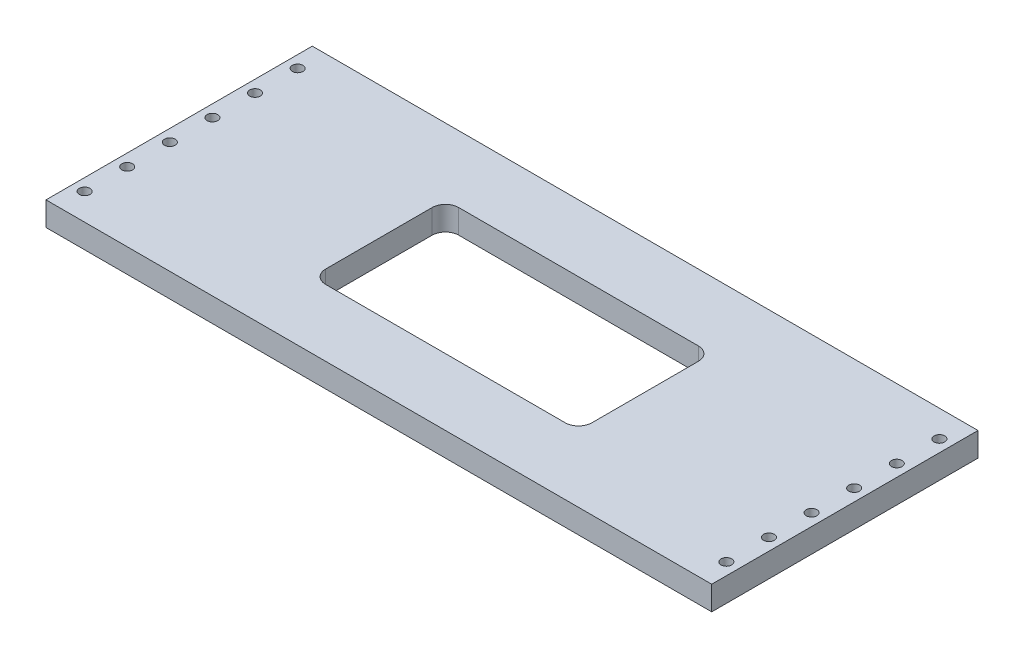
ISO-10303-21;
HEADER;
FILE_DESCRIPTION(('STEP AP214'),'2;1');
FILE_NAME('part.step','',(''),(''),'','','');
FILE_SCHEMA(('AUTOMOTIVE_DESIGN { 1 0 10303 214 1 1 1 1 }'));
ENDSEC;
DATA;
#1=APPLICATION_CONTEXT('core data for automotive mechanical design processes');
#2=APPLICATION_PROTOCOL_DEFINITION('international standard','automotive_design',2000,#1);
#3=PRODUCT_CONTEXT('',#1,'mechanical');
#4=PRODUCT('Part','Part','',(#3));
#5=PRODUCT_RELATED_PRODUCT_CATEGORY('part','',(#4));
#6=PRODUCT_DEFINITION_FORMATION('','',#4);
#7=PRODUCT_DEFINITION_CONTEXT('part definition',#1,'design');
#8=PRODUCT_DEFINITION('design','',#6,#7);
#9=PRODUCT_DEFINITION_SHAPE('','',#8);
#10=(LENGTH_UNIT() NAMED_UNIT(*) SI_UNIT(.MILLI.,.METRE.));
#11=(NAMED_UNIT(*) PLANE_ANGLE_UNIT() SI_UNIT($,.RADIAN.));
#12=(NAMED_UNIT(*) SI_UNIT($,.STERADIAN.) SOLID_ANGLE_UNIT());
#13=UNCERTAINTY_MEASURE_WITH_UNIT(LENGTH_MEASURE(1.E-05),#10,'distance_accuracy_value','');
#14=(GEOMETRIC_REPRESENTATION_CONTEXT(3) GLOBAL_UNCERTAINTY_ASSIGNED_CONTEXT((#13)) GLOBAL_UNIT_ASSIGNED_CONTEXT((#10,
#11,#12)) REPRESENTATION_CONTEXT('',''));
#15=CARTESIAN_POINT('',(0.,0.,0.));
#16=DIRECTION('',(0.,0.,1.));
#17=DIRECTION('',(1.,0.,0.));
#18=AXIS2_PLACEMENT_3D('',#15,#16,#17);
#19=CARTESIAN_POINT('',(0.,18.,0.));
#20=DIRECTION('',(1.,0.,0.));
#21=DIRECTION('',(0.,0.,-1.));
#22=AXIS2_PLACEMENT_3D('',#19,#20,#21);
#23=PLANE('',#22);
#24=DIRECTION('',(0.,0.,1.));
#25=VECTOR('',#24,1.);
#26=CARTESIAN_POINT('',(0.,0.,0.));
#27=LINE('',#26,#25);
#28=CARTESIAN_POINT('',(0.,0.,-200.));
#29=VERTEX_POINT('',#28);
#30=CARTESIAN_POINT('',(0.,0.,0.));
#31=VERTEX_POINT('',#30);
#32=EDGE_CURVE('E241',#29,#31,#27,.T.);
#33=ORIENTED_EDGE('',*,*,#32,.T.);
#34=DIRECTION('',(0.,-1.,0.));
#35=VECTOR('',#34,1.);
#36=CARTESIAN_POINT('',(0.,18.,0.));
#37=LINE('',#36,#35);
#38=CARTESIAN_POINT('',(0.,18.,0.));
#39=VERTEX_POINT('',#38);
#40=EDGE_CURVE('E270',#39,#31,#37,.T.);
#41=ORIENTED_EDGE('',*,*,#40,.F.);
#42=DIRECTION('',(0.,0.,1.));
#43=VECTOR('',#42,1.);
#44=CARTESIAN_POINT('',(0.,18.,0.));
#45=LINE('',#44,#43);
#46=CARTESIAN_POINT('',(0.,18.,-200.));
#47=VERTEX_POINT('',#46);
#48=EDGE_CURVE('E244',#47,#39,#45,.T.);
#49=ORIENTED_EDGE('',*,*,#48,.F.);
#50=DIRECTION('',(0.,-1.,0.));
#51=VECTOR('',#50,1.);
#52=CARTESIAN_POINT('',(0.,18.,-200.));
#53=LINE('',#52,#51);
#54=EDGE_CURVE('E254',#47,#29,#53,.T.);
#55=ORIENTED_EDGE('',*,*,#54,.T.);
#56=EDGE_LOOP('',(#33,#41,#49,#55));
#57=FACE_BOUND('',#56,.T.);
#58=ADVANCED_FACE('F35',(#57),#23,.F.);
#59=CARTESIAN_POINT('',(0.,18.,0.));
#60=DIRECTION('',(0.,0.,-1.));
#61=DIRECTION('',(-1.,0.,0.));
#62=AXIS2_PLACEMENT_3D('',#59,#60,#61);
#63=PLANE('',#62);
#64=DIRECTION('',(1.,0.,0.));
#65=VECTOR('',#64,1.);
#66=CARTESIAN_POINT('',(0.,0.,0.));
#67=LINE('',#66,#65);
#68=CARTESIAN_POINT('',(500.,0.,0.));
#69=VERTEX_POINT('',#68);
#70=EDGE_CURVE('E257',#31,#69,#67,.T.);
#71=ORIENTED_EDGE('',*,*,#70,.T.);
#72=DIRECTION('',(0.,-1.,0.));
#73=VECTOR('',#72,1.);
#74=CARTESIAN_POINT('',(500.,18.,0.));
#75=LINE('',#74,#73);
#76=CARTESIAN_POINT('',(500.,18.,0.));
#77=VERTEX_POINT('',#76);
#78=EDGE_CURVE('E267',#77,#69,#75,.T.);
#79=ORIENTED_EDGE('',*,*,#78,.F.);
#80=DIRECTION('',(1.,0.,0.));
#81=VECTOR('',#80,1.);
#82=CARTESIAN_POINT('',(0.,18.,0.));
#83=LINE('',#82,#81);
#84=EDGE_CURVE('E247',#39,#77,#83,.T.);
#85=ORIENTED_EDGE('',*,*,#84,.F.);
#86=ORIENTED_EDGE('',*,*,#40,.T.);
#87=EDGE_LOOP('',(#71,#79,#85,#86));
#88=FACE_BOUND('',#87,.T.);
#89=ADVANCED_FACE('F325',(#88),#63,.F.);
#90=CARTESIAN_POINT('',(500.,18.,0.));
#91=DIRECTION('',(-1.,0.,0.));
#92=DIRECTION('',(0.,0.,1.));
#93=AXIS2_PLACEMENT_3D('',#90,#91,#92);
#94=PLANE('',#93);
#95=DIRECTION('',(0.,0.,-1.));
#96=VECTOR('',#95,1.);
#97=CARTESIAN_POINT('',(500.,0.,0.));
#98=LINE('',#97,#96);
#99=CARTESIAN_POINT('',(500.,0.,-200.));
#100=VERTEX_POINT('',#99);
#101=EDGE_CURVE('E259',#69,#100,#98,.T.);
#102=ORIENTED_EDGE('',*,*,#101,.T.);
#103=DIRECTION('',(0.,-1.,0.));
#104=VECTOR('',#103,1.);
#105=CARTESIAN_POINT('',(500.,18.,-200.));
#106=LINE('',#105,#104);
#107=CARTESIAN_POINT('',(500.,18.,-200.));
#108=VERTEX_POINT('',#107);
#109=EDGE_CURVE('E264',#108,#100,#106,.T.);
#110=ORIENTED_EDGE('',*,*,#109,.F.);
#111=DIRECTION('',(0.,0.,-1.));
#112=VECTOR('',#111,1.);
#113=CARTESIAN_POINT('',(500.,18.,0.));
#114=LINE('',#113,#112);
#115=EDGE_CURVE('E250',#77,#108,#114,.T.);
#116=ORIENTED_EDGE('',*,*,#115,.F.);
#117=ORIENTED_EDGE('',*,*,#78,.T.);
#118=EDGE_LOOP('',(#102,#110,#116,#117));
#119=FACE_BOUND('',#118,.T.);
#120=ADVANCED_FACE('F330',(#119),#94,.F.);
#121=CARTESIAN_POINT('',(0.,18.,-200.));
#122=DIRECTION('',(0.,0.,1.));
#123=DIRECTION('',(1.,0.,0.));
#124=AXIS2_PLACEMENT_3D('',#121,#122,#123);
#125=PLANE('',#124);
#126=DIRECTION('',(-1.,0.,0.));
#127=VECTOR('',#126,1.);
#128=CARTESIAN_POINT('',(0.,0.,-200.));
#129=LINE('',#128,#127);
#130=EDGE_CURVE('E248',#100,#29,#129,.T.);
#131=ORIENTED_EDGE('',*,*,#130,.T.);
#132=ORIENTED_EDGE('',*,*,#54,.F.);
#133=DIRECTION('',(-1.,0.,0.));
#134=VECTOR('',#133,1.);
#135=CARTESIAN_POINT('',(0.,18.,-200.));
#136=LINE('',#135,#134);
#137=EDGE_CURVE('E252',#108,#47,#136,.T.);
#138=ORIENTED_EDGE('',*,*,#137,.F.);
#139=ORIENTED_EDGE('',*,*,#109,.T.);
#140=EDGE_LOOP('',(#131,#132,#138,#139));
#141=FACE_BOUND('',#140,.T.);
#142=ADVANCED_FACE('F344',(#141),#125,.F.);
#143=CARTESIAN_POINT('',(0.,18.,0.));
#144=DIRECTION('',(0.,-1.,0.));
#145=DIRECTION('',(0.,0.,-1.));
#146=AXIS2_PLACEMENT_3D('',#143,#144,#145);
#147=PLANE('',#146);
#148=DIRECTION('',(-1.,0.,0.));
#149=VECTOR('',#148,1.);
#150=CARTESIAN_POINT('',(160.,18.,-150.));
#151=LINE('',#150,#149);
#152=CARTESIAN_POINT('',(340.,18.,-150.));
#153=VERTEX_POINT('',#152);
#154=CARTESIAN_POINT('',(160.,18.,-150.));
#155=VERTEX_POINT('',#154);
#156=EDGE_CURVE('E134',#153,#155,#151,.T.);
#157=ORIENTED_EDGE('',*,*,#156,.F.);
#158=CARTESIAN_POINT('',(340.,18.,-140.));
#159=DIRECTION('',(0.,1.,0.));
#160=DIRECTION('',(0.,0.,-1.));
#161=AXIS2_PLACEMENT_3D('',#158,#159,#160);
#162=CIRCLE('',#161,10.);
#163=CARTESIAN_POINT('',(350.,18.,-140.));
#164=VERTEX_POINT('',#163);
#165=EDGE_CURVE('E49',#164,#153,#162,.T.);
#166=ORIENTED_EDGE('',*,*,#165,.F.);
#167=DIRECTION('',(0.,0.,-1.));
#168=VECTOR('',#167,1.);
#169=CARTESIAN_POINT('',(350.,18.,-140.));
#170=LINE('',#169,#168);
#171=CARTESIAN_POINT('',(350.,18.,-60.0000000000001));
#172=VERTEX_POINT('',#171);
#173=EDGE_CURVE('E156',#172,#164,#170,.T.);
#174=ORIENTED_EDGE('',*,*,#173,.F.);
#175=CARTESIAN_POINT('',(340.,18.,-60.));
#176=DIRECTION('',(0.,1.,0.));
#177=DIRECTION('',(0.,0.,1.));
#178=AXIS2_PLACEMENT_3D('',#175,#176,#177);
#179=CIRCLE('',#178,10.);
#180=CARTESIAN_POINT('',(340.,18.,-50.));
#181=VERTEX_POINT('',#180);
#182=EDGE_CURVE('E153',#181,#172,#179,.T.);
#183=ORIENTED_EDGE('',*,*,#182,.F.);
#184=DIRECTION('',(1.,0.,0.));
#185=VECTOR('',#184,1.);
#186=CARTESIAN_POINT('',(160.,18.,-50.));
#187=LINE('',#186,#185);
#188=CARTESIAN_POINT('',(160.,18.,-50.));
#189=VERTEX_POINT('',#188);
#190=EDGE_CURVE('E150',#189,#181,#187,.T.);
#191=ORIENTED_EDGE('',*,*,#190,.F.);
#192=CARTESIAN_POINT('',(160.,18.,-60.));
#193=DIRECTION('',(0.,1.,0.));
#194=DIRECTION('',(0.,0.,1.));
#195=AXIS2_PLACEMENT_3D('',#192,#193,#194);
#196=CIRCLE('',#195,10.);
#197=CARTESIAN_POINT('',(150.,18.,-60.0000000000001));
#198=VERTEX_POINT('',#197);
#199=EDGE_CURVE('E144',#198,#189,#196,.T.);
#200=ORIENTED_EDGE('',*,*,#199,.F.);
#201=DIRECTION('',(0.,0.,1.));
#202=VECTOR('',#201,1.);
#203=CARTESIAN_POINT('',(150.,18.,-140.));
#204=LINE('',#203,#202);
#205=CARTESIAN_POINT('',(150.,18.,-140.));
#206=VERTEX_POINT('',#205);
#207=EDGE_CURVE('E142',#206,#198,#204,.T.);
#208=ORIENTED_EDGE('',*,*,#207,.F.);
#209=CARTESIAN_POINT('',(160.,18.,-140.));
#210=DIRECTION('',(0.,1.,0.));
#211=DIRECTION('',(0.,0.,1.));
#212=AXIS2_PLACEMENT_3D('',#209,#210,#211);
#213=CIRCLE('',#212,10.);
#214=EDGE_CURVE('E125',#155,#206,#213,.T.);
#215=ORIENTED_EDGE('',*,*,#214,.F.);
#216=EDGE_LOOP('',(#157,#166,#174,#183,#191,#200,#208,#215));
#217=FACE_BOUND('',#216,.T.);
#218=CARTESIAN_POINT('',(490.999999999999,18.,-84.));
#219=DIRECTION('',(0.,1.,0.));
#220=DIRECTION('',(0.,0.,-1.));
#221=AXIS2_PLACEMENT_3D('',#218,#219,#220);
#222=CIRCLE('',#221,3.99999999999999);
#223=CARTESIAN_POINT('',(490.999999999999,18.,-88.));
#224=VERTEX_POINT('',#223);
#225=EDGE_CURVE('E175',#224,#224,#222,.T.);
#226=ORIENTED_EDGE('',*,*,#225,.F.);
#227=EDGE_LOOP('',(#226));
#228=FACE_BOUND('',#227,.T.);
#229=CARTESIAN_POINT('',(490.999999999998,18.,-52.));
#230=DIRECTION('',(0.,1.,0.));
#231=DIRECTION('',(0.,0.,-1.));
#232=AXIS2_PLACEMENT_3D('',#229,#230,#231);
#233=CIRCLE('',#232,3.99999999999999);
#234=CARTESIAN_POINT('',(490.999999999998,18.,-56.));
#235=VERTEX_POINT('',#234);
#236=EDGE_CURVE('E206',#235,#235,#233,.T.);
#237=ORIENTED_EDGE('',*,*,#236,.F.);
#238=EDGE_LOOP('',(#237));
#239=FACE_BOUND('',#238,.T.);
#240=CARTESIAN_POINT('',(490.999999999998,18.,-20.));
#241=DIRECTION('',(0.,1.,0.));
#242=DIRECTION('',(0.,0.,-1.));
#243=AXIS2_PLACEMENT_3D('',#240,#241,#242);
#244=CIRCLE('',#243,3.99999999999999);
#245=CARTESIAN_POINT('',(490.999999999998,18.,-24.));
#246=VERTEX_POINT('',#245);
#247=EDGE_CURVE('E200',#246,#246,#244,.T.);
#248=ORIENTED_EDGE('',*,*,#247,.F.);
#249=EDGE_LOOP('',(#248));
#250=FACE_BOUND('',#249,.T.);
#251=CARTESIAN_POINT('',(9.00000000000223,18.,-20.));
#252=DIRECTION('',(0.,1.,0.));
#253=DIRECTION('',(0.,0.,1.));
#254=AXIS2_PLACEMENT_3D('',#251,#252,#253);
#255=CIRCLE('',#254,4.);
#256=CARTESIAN_POINT('',(9.00000000000223,18.,-16.));
#257=VERTEX_POINT('',#256);
#258=EDGE_CURVE('E194',#257,#257,#255,.T.);
#259=ORIENTED_EDGE('',*,*,#258,.F.);
#260=EDGE_LOOP('',(#259));
#261=FACE_BOUND('',#260,.T.);
#262=CARTESIAN_POINT('',(9.00000000000179,18.,-52.));
#263=DIRECTION('',(0.,1.,0.));
#264=DIRECTION('',(0.,0.,1.));
#265=AXIS2_PLACEMENT_3D('',#262,#263,#264);
#266=CIRCLE('',#265,4.);
#267=CARTESIAN_POINT('',(9.00000000000179,18.,-48.));
#268=VERTEX_POINT('',#267);
#269=EDGE_CURVE('E193',#268,#268,#266,.T.);
#270=ORIENTED_EDGE('',*,*,#269,.F.);
#271=EDGE_LOOP('',(#270));
#272=FACE_BOUND('',#271,.T.);
#273=CARTESIAN_POINT('',(9.00000000000134,18.,-84.));
#274=DIRECTION('',(0.,1.,0.));
#275=DIRECTION('',(0.,0.,1.));
#276=AXIS2_PLACEMENT_3D('',#273,#274,#275);
#277=CIRCLE('',#276,4.);
#278=CARTESIAN_POINT('',(9.00000000000134,18.,-80.));
#279=VERTEX_POINT('',#278);
#280=EDGE_CURVE('E230',#279,#279,#277,.T.);
#281=ORIENTED_EDGE('',*,*,#280,.F.);
#282=EDGE_LOOP('',(#281));
#283=FACE_BOUND('',#282,.T.);
#284=CARTESIAN_POINT('',(9.00000000000089,18.,-116.));
#285=DIRECTION('',(0.,1.,0.));
#286=DIRECTION('',(0.,0.,1.));
#287=AXIS2_PLACEMENT_3D('',#284,#285,#286);
#288=CIRCLE('',#287,4.);
#289=CARTESIAN_POINT('',(9.00000000000089,18.,-112.));
#290=VERTEX_POINT('',#289);
#291=EDGE_CURVE('E224',#290,#290,#288,.T.);
#292=ORIENTED_EDGE('',*,*,#291,.F.);
#293=EDGE_LOOP('',(#292));
#294=FACE_BOUND('',#293,.T.);
#295=CARTESIAN_POINT('',(9.00000000000045,18.,-148.));
#296=DIRECTION('',(0.,1.,0.));
#297=DIRECTION('',(0.,0.,1.));
#298=AXIS2_PLACEMENT_3D('',#295,#296,#297);
#299=CIRCLE('',#298,4.);
#300=CARTESIAN_POINT('',(9.00000000000045,18.,-144.));
#301=VERTEX_POINT('',#300);
#302=EDGE_CURVE('E218',#301,#301,#299,.T.);
#303=ORIENTED_EDGE('',*,*,#302,.F.);
#304=EDGE_LOOP('',(#303));
#305=FACE_BOUND('',#304,.T.);
#306=CARTESIAN_POINT('',(490.999999999999,18.,-116.));
#307=DIRECTION('',(0.,1.,0.));
#308=DIRECTION('',(0.,0.,-1.));
#309=AXIS2_PLACEMENT_3D('',#306,#307,#308);
#310=CIRCLE('',#309,3.99999999999999);
#311=CARTESIAN_POINT('',(490.999999999999,18.,-120.));
#312=VERTEX_POINT('',#311);
#313=EDGE_CURVE('E176',#312,#312,#310,.T.);
#314=ORIENTED_EDGE('',*,*,#313,.F.);
#315=EDGE_LOOP('',(#314));
#316=FACE_BOUND('',#315,.T.);
#317=CARTESIAN_POINT('',(491.,18.,-148.));
#318=DIRECTION('',(0.,1.,0.));
#319=DIRECTION('',(0.,0.,-1.));
#320=AXIS2_PLACEMENT_3D('',#317,#318,#319);
#321=CIRCLE('',#320,3.99999999999999);
#322=CARTESIAN_POINT('',(491.,18.,-152.));
#323=VERTEX_POINT('',#322);
#324=EDGE_CURVE('E182',#323,#323,#321,.T.);
#325=ORIENTED_EDGE('',*,*,#324,.F.);
#326=EDGE_LOOP('',(#325));
#327=FACE_BOUND('',#326,.T.);
#328=CARTESIAN_POINT('',(491.,18.,-180.));
#329=DIRECTION('',(0.,1.,0.));
#330=DIRECTION('',(0.,0.,-1.));
#331=AXIS2_PLACEMENT_3D('',#328,#329,#330);
#332=CIRCLE('',#331,3.99999999999999);
#333=CARTESIAN_POINT('',(491.,18.,-184.));
#334=VERTEX_POINT('',#333);
#335=EDGE_CURVE('E161',#334,#334,#332,.T.);
#336=ORIENTED_EDGE('',*,*,#335,.F.);
#337=EDGE_LOOP('',(#336));
#338=FACE_BOUND('',#337,.T.);
#339=CARTESIAN_POINT('',(9.,18.,-180.));
#340=DIRECTION('',(0.,1.,0.));
#341=DIRECTION('',(0.,0.,1.));
#342=AXIS2_PLACEMENT_3D('',#339,#340,#341);
#343=CIRCLE('',#342,4.);
#344=CARTESIAN_POINT('',(9.,18.,-176.));
#345=VERTEX_POINT('',#344);
#346=EDGE_CURVE('E217',#345,#345,#343,.T.);
#347=ORIENTED_EDGE('',*,*,#346,.F.);
#348=EDGE_LOOP('',(#347));
#349=FACE_BOUND('',#348,.T.);
#350=ORIENTED_EDGE('',*,*,#48,.T.);
#351=ORIENTED_EDGE('',*,*,#84,.T.);
#352=ORIENTED_EDGE('',*,*,#115,.T.);
#353=ORIENTED_EDGE('',*,*,#137,.T.);
#354=EDGE_LOOP('',(#350,#351,#352,#353));
#355=FACE_BOUND('',#354,.T.);
#356=ADVANCED_FACE('F138',(#217,#228,#239,#250,#261,#272,#283,#294,#305,#316,#327,#338,#349,
#355),#147,.F.);
#357=CARTESIAN_POINT('',(0.,0.,0.));
#358=DIRECTION('',(0.,-1.,0.));
#359=DIRECTION('',(0.,0.,-1.));
#360=AXIS2_PLACEMENT_3D('',#357,#358,#359);
#361=PLANE('',#360);
#362=CARTESIAN_POINT('',(340.,0.,-140.));
#363=DIRECTION('',(0.,-1.,0.));
#364=DIRECTION('',(0.,0.,-1.));
#365=AXIS2_PLACEMENT_3D('',#362,#363,#364);
#366=CIRCLE('',#365,10.);
#367=CARTESIAN_POINT('',(340.,0.,-150.));
#368=VERTEX_POINT('',#367);
#369=CARTESIAN_POINT('',(350.,0.,-140.));
#370=VERTEX_POINT('',#369);
#371=EDGE_CURVE('E11',#368,#370,#366,.T.);
#372=ORIENTED_EDGE('',*,*,#371,.F.);
#373=DIRECTION('',(1.,0.,0.));
#374=VECTOR('',#373,1.);
#375=CARTESIAN_POINT('',(0.,0.,-150.));
#376=LINE('',#375,#374);
#377=CARTESIAN_POINT('',(160.,0.,-150.));
#378=VERTEX_POINT('',#377);
#379=EDGE_CURVE('E273',#378,#368,#376,.T.);
#380=ORIENTED_EDGE('',*,*,#379,.F.);
#381=CARTESIAN_POINT('',(160.,0.,-140.));
#382=DIRECTION('',(0.,-1.,0.));
#383=DIRECTION('',(0.,0.,-1.));
#384=AXIS2_PLACEMENT_3D('',#381,#382,#383);
#385=CIRCLE('',#384,10.);
#386=CARTESIAN_POINT('',(150.,0.,-140.));
#387=VERTEX_POINT('',#386);
#388=EDGE_CURVE('E128',#387,#378,#385,.T.);
#389=ORIENTED_EDGE('',*,*,#388,.F.);
#390=DIRECTION('',(0.,0.,-1.));
#391=VECTOR('',#390,1.);
#392=CARTESIAN_POINT('',(150.,0.,0.));
#393=LINE('',#392,#391);
#394=CARTESIAN_POINT('',(150.,0.,-60.0000000000001));
#395=VERTEX_POINT('',#394);
#396=EDGE_CURVE('E276',#395,#387,#393,.T.);
#397=ORIENTED_EDGE('',*,*,#396,.F.);
#398=CARTESIAN_POINT('',(160.,0.,-60.));
#399=DIRECTION('',(0.,-1.,0.));
#400=DIRECTION('',(0.,0.,-1.));
#401=AXIS2_PLACEMENT_3D('',#398,#399,#400);
#402=CIRCLE('',#401,10.);
#403=CARTESIAN_POINT('',(160.,0.,-50.));
#404=VERTEX_POINT('',#403);
#405=EDGE_CURVE('E278',#404,#395,#402,.T.);
#406=ORIENTED_EDGE('',*,*,#405,.F.);
#407=DIRECTION('',(-1.,0.,0.));
#408=VECTOR('',#407,1.);
#409=CARTESIAN_POINT('',(0.,0.,-50.));
#410=LINE('',#409,#408);
#411=CARTESIAN_POINT('',(340.,0.,-50.));
#412=VERTEX_POINT('',#411);
#413=EDGE_CURVE('E280',#412,#404,#410,.T.);
#414=ORIENTED_EDGE('',*,*,#413,.F.);
#415=CARTESIAN_POINT('',(340.,0.,-60.));
#416=DIRECTION('',(0.,-1.,0.));
#417=DIRECTION('',(0.,0.,-1.));
#418=AXIS2_PLACEMENT_3D('',#415,#416,#417);
#419=CIRCLE('',#418,10.);
#420=CARTESIAN_POINT('',(350.,0.,-60.0000000000001));
#421=VERTEX_POINT('',#420);
#422=EDGE_CURVE('E282',#421,#412,#419,.T.);
#423=ORIENTED_EDGE('',*,*,#422,.F.);
#424=DIRECTION('',(0.,0.,1.));
#425=VECTOR('',#424,1.);
#426=CARTESIAN_POINT('',(350.,0.,0.));
#427=LINE('',#426,#425);
#428=EDGE_CURVE('E42',#370,#421,#427,.T.);
#429=ORIENTED_EDGE('',*,*,#428,.F.);
#430=EDGE_LOOP('',(#372,#380,#389,#397,#406,#414,#423,#429));
#431=FACE_BOUND('',#430,.T.);
#432=ORIENTED_EDGE('',*,*,#32,.F.);
#433=ORIENTED_EDGE('',*,*,#130,.F.);
#434=ORIENTED_EDGE('',*,*,#101,.F.);
#435=ORIENTED_EDGE('',*,*,#70,.F.);
#436=EDGE_LOOP('',(#432,#433,#434,#435));
#437=FACE_BOUND('',#436,.T.);
#438=ADVANCED_FACE('F297',(#431,#437),#361,.T.);
#439=CARTESIAN_POINT('',(9.,8.,-180.));
#440=DIRECTION('',(0.,1.,0.));
#441=DIRECTION('',(0.,0.,1.));
#442=AXIS2_PLACEMENT_3D('',#439,#440,#441);
#443=CYLINDRICAL_SURFACE('',#442,4.);
#444=CARTESIAN_POINT('',(9.,8.,-180.));
#445=DIRECTION('',(0.,1.,0.));
#446=DIRECTION('',(0.,0.,1.));
#447=AXIS2_PLACEMENT_3D('',#444,#445,#446);
#448=CIRCLE('',#447,4.);
#449=CARTESIAN_POINT('',(9.,8.,-176.));
#450=VERTEX_POINT('',#449);
#451=EDGE_CURVE('E238',#450,#450,#448,.T.);
#452=ORIENTED_EDGE('',*,*,#451,.F.);
#453=EDGE_LOOP('',(#452));
#454=FACE_BOUND('',#453,.T.);
#455=ORIENTED_EDGE('',*,*,#346,.T.);
#456=EDGE_LOOP('',(#455));
#457=FACE_BOUND('',#456,.T.);
#458=ADVANCED_FACE('F355',(#454,#457),#443,.F.);
#459=CARTESIAN_POINT('',(9.,8.,-180.));
#460=DIRECTION('',(0.,1.,0.));
#461=DIRECTION('',(0.,0.,1.));
#462=AXIS2_PLACEMENT_3D('',#459,#460,#461);
#463=PLANE('',#462);
#464=ORIENTED_EDGE('',*,*,#451,.T.);
#465=EDGE_LOOP('',(#464));
#466=FACE_BOUND('',#465,.T.);
#467=ADVANCED_FACE('F360',(#466),#463,.T.);
#468=CARTESIAN_POINT('',(491.,8.,-180.));
#469=DIRECTION('',(0.,1.,0.));
#470=DIRECTION('',(0.,0.,1.));
#471=AXIS2_PLACEMENT_3D('',#468,#469,#470);
#472=CYLINDRICAL_SURFACE('',#471,3.99999999999999);
#473=CARTESIAN_POINT('',(491.,8.,-180.));
#474=DIRECTION('',(0.,1.,0.));
#475=DIRECTION('',(0.,0.,-1.));
#476=AXIS2_PLACEMENT_3D('',#473,#474,#475);
#477=CIRCLE('',#476,3.99999999999999);
#478=CARTESIAN_POINT('',(491.,8.,-184.));
#479=VERTEX_POINT('',#478);
#480=EDGE_CURVE('E185',#479,#479,#477,.T.);
#481=ORIENTED_EDGE('',*,*,#480,.F.);
#482=EDGE_LOOP('',(#481));
#483=FACE_BOUND('',#482,.T.);
#484=ORIENTED_EDGE('',*,*,#335,.T.);
#485=EDGE_LOOP('',(#484));
#486=FACE_BOUND('',#485,.T.);
#487=ADVANCED_FACE('F364',(#483,#486),#472,.F.);
#488=CARTESIAN_POINT('',(491.,8.,-180.));
#489=DIRECTION('',(0.,-1.,0.));
#490=DIRECTION('',(0.,0.,-1.));
#491=AXIS2_PLACEMENT_3D('',#488,#489,#490);
#492=PLANE('',#491);
#493=ORIENTED_EDGE('',*,*,#480,.T.);
#494=EDGE_LOOP('',(#493));
#495=FACE_BOUND('',#494,.T.);
#496=ADVANCED_FACE('F428',(#495),#492,.F.);
#497=CARTESIAN_POINT('',(491.,8.,-148.));
#498=DIRECTION('',(0.,1.,0.));
#499=DIRECTION('',(0.,0.,1.));
#500=AXIS2_PLACEMENT_3D('',#497,#498,#499);
#501=CYLINDRICAL_SURFACE('',#500,3.99999999999999);
#502=CARTESIAN_POINT('',(491.,8.,-148.));
#503=DIRECTION('',(0.,1.,0.));
#504=DIRECTION('',(0.,0.,-1.));
#505=AXIS2_PLACEMENT_3D('',#502,#503,#504);
#506=CIRCLE('',#505,3.99999999999999);
#507=CARTESIAN_POINT('',(491.,8.,-152.));
#508=VERTEX_POINT('',#507);
#509=EDGE_CURVE('E179',#508,#508,#506,.T.);
#510=ORIENTED_EDGE('',*,*,#509,.F.);
#511=EDGE_LOOP('',(#510));
#512=FACE_BOUND('',#511,.T.);
#513=ORIENTED_EDGE('',*,*,#324,.T.);
#514=EDGE_LOOP('',(#513));
#515=FACE_BOUND('',#514,.T.);
#516=ADVANCED_FACE('F432',(#512,#515),#501,.F.);
#517=CARTESIAN_POINT('',(491.,8.,-148.));
#518=DIRECTION('',(0.,-1.,0.));
#519=DIRECTION('',(0.,0.,-1.));
#520=AXIS2_PLACEMENT_3D('',#517,#518,#519);
#521=PLANE('',#520);
#522=ORIENTED_EDGE('',*,*,#509,.T.);
#523=EDGE_LOOP('',(#522));
#524=FACE_BOUND('',#523,.T.);
#525=ADVANCED_FACE('F436',(#524),#521,.F.);
#526=CARTESIAN_POINT('',(490.999999999999,8.,-116.));
#527=DIRECTION('',(0.,1.,0.));
#528=DIRECTION('',(0.,0.,1.));
#529=AXIS2_PLACEMENT_3D('',#526,#527,#528);
#530=CYLINDRICAL_SURFACE('',#529,3.99999999999999);
#531=CARTESIAN_POINT('',(490.999999999999,8.,-116.));
#532=DIRECTION('',(0.,1.,0.));
#533=DIRECTION('',(0.,0.,-1.));
#534=AXIS2_PLACEMENT_3D('',#531,#532,#533);
#535=CIRCLE('',#534,3.99999999999999);
#536=CARTESIAN_POINT('',(490.999999999999,8.,-120.));
#537=VERTEX_POINT('',#536);
#538=EDGE_CURVE('E172',#537,#537,#535,.T.);
#539=ORIENTED_EDGE('',*,*,#538,.F.);
#540=EDGE_LOOP('',(#539));
#541=FACE_BOUND('',#540,.T.);
#542=ORIENTED_EDGE('',*,*,#313,.T.);
#543=EDGE_LOOP('',(#542));
#544=FACE_BOUND('',#543,.T.);
#545=ADVANCED_FACE('F440',(#541,#544),#530,.F.);
#546=CARTESIAN_POINT('',(490.999999999999,8.,-116.));
#547=DIRECTION('',(0.,-1.,0.));
#548=DIRECTION('',(0.,0.,-1.));
#549=AXIS2_PLACEMENT_3D('',#546,#547,#548);
#550=PLANE('',#549);
#551=ORIENTED_EDGE('',*,*,#538,.T.);
#552=EDGE_LOOP('',(#551));
#553=FACE_BOUND('',#552,.T.);
#554=ADVANCED_FACE('F395',(#553),#550,.F.);
#555=CARTESIAN_POINT('',(9.00000000000045,8.,-148.));
#556=DIRECTION('',(0.,1.,0.));
#557=DIRECTION('',(0.,0.,1.));
#558=AXIS2_PLACEMENT_3D('',#555,#556,#557);
#559=CYLINDRICAL_SURFACE('',#558,4.);
#560=CARTESIAN_POINT('',(9.00000000000045,8.,-148.));
#561=DIRECTION('',(0.,1.,0.));
#562=DIRECTION('',(0.,0.,1.));
#563=AXIS2_PLACEMENT_3D('',#560,#561,#562);
#564=CIRCLE('',#563,4.);
#565=CARTESIAN_POINT('',(9.00000000000045,8.,-144.));
#566=VERTEX_POINT('',#565);
#567=EDGE_CURVE('E214',#566,#566,#564,.T.);
#568=ORIENTED_EDGE('',*,*,#567,.F.);
#569=EDGE_LOOP('',(#568));
#570=FACE_BOUND('',#569,.T.);
#571=ORIENTED_EDGE('',*,*,#302,.T.);
#572=EDGE_LOOP('',(#571));
#573=FACE_BOUND('',#572,.T.);
#574=ADVANCED_FACE('F392',(#570,#573),#559,.F.);
#575=CARTESIAN_POINT('',(9.00000000000045,8.,-148.));
#576=DIRECTION('',(0.,1.,0.));
#577=DIRECTION('',(0.,0.,1.));
#578=AXIS2_PLACEMENT_3D('',#575,#576,#577);
#579=PLANE('',#578);
#580=ORIENTED_EDGE('',*,*,#567,.T.);
#581=EDGE_LOOP('',(#580));
#582=FACE_BOUND('',#581,.T.);
#583=ADVANCED_FACE('F387',(#582),#579,.T.);
#584=CARTESIAN_POINT('',(9.00000000000089,8.,-116.));
#585=DIRECTION('',(0.,1.,0.));
#586=DIRECTION('',(0.,0.,1.));
#587=AXIS2_PLACEMENT_3D('',#584,#585,#586);
#588=CYLINDRICAL_SURFACE('',#587,4.);
#589=CARTESIAN_POINT('',(9.00000000000089,8.,-116.));
#590=DIRECTION('',(0.,1.,0.));
#591=DIRECTION('',(0.,0.,1.));
#592=AXIS2_PLACEMENT_3D('',#589,#590,#591);
#593=CIRCLE('',#592,4.);
#594=CARTESIAN_POINT('',(9.00000000000089,8.,-112.));
#595=VERTEX_POINT('',#594);
#596=EDGE_CURVE('E221',#595,#595,#593,.T.);
#597=ORIENTED_EDGE('',*,*,#596,.F.);
#598=EDGE_LOOP('',(#597));
#599=FACE_BOUND('',#598,.T.);
#600=ORIENTED_EDGE('',*,*,#291,.T.);
#601=EDGE_LOOP('',(#600));
#602=FACE_BOUND('',#601,.T.);
#603=ADVANCED_FACE('F384',(#599,#602),#588,.F.);
#604=CARTESIAN_POINT('',(9.00000000000089,8.,-116.));
#605=DIRECTION('',(0.,1.,0.));
#606=DIRECTION('',(0.,0.,1.));
#607=AXIS2_PLACEMENT_3D('',#604,#605,#606);
#608=PLANE('',#607);
#609=ORIENTED_EDGE('',*,*,#596,.T.);
#610=EDGE_LOOP('',(#609));
#611=FACE_BOUND('',#610,.T.);
#612=ADVANCED_FACE('F379',(#611),#608,.T.);
#613=CARTESIAN_POINT('',(9.00000000000134,8.,-84.));
#614=DIRECTION('',(0.,1.,0.));
#615=DIRECTION('',(0.,0.,1.));
#616=AXIS2_PLACEMENT_3D('',#613,#614,#615);
#617=CYLINDRICAL_SURFACE('',#616,4.);
#618=CARTESIAN_POINT('',(9.00000000000134,8.,-84.));
#619=DIRECTION('',(0.,1.,0.));
#620=DIRECTION('',(0.,0.,1.));
#621=AXIS2_PLACEMENT_3D('',#618,#619,#620);
#622=CIRCLE('',#621,4.);
#623=CARTESIAN_POINT('',(9.00000000000134,8.,-80.));
#624=VERTEX_POINT('',#623);
#625=EDGE_CURVE('E227',#624,#624,#622,.T.);
#626=ORIENTED_EDGE('',*,*,#625,.F.);
#627=EDGE_LOOP('',(#626));
#628=FACE_BOUND('',#627,.T.);
#629=ORIENTED_EDGE('',*,*,#280,.T.);
#630=EDGE_LOOP('',(#629));
#631=FACE_BOUND('',#630,.T.);
#632=ADVANCED_FACE('F376',(#628,#631),#617,.F.);
#633=CARTESIAN_POINT('',(9.00000000000134,8.,-84.));
#634=DIRECTION('',(0.,1.,0.));
#635=DIRECTION('',(0.,0.,1.));
#636=AXIS2_PLACEMENT_3D('',#633,#634,#635);
#637=PLANE('',#636);
#638=ORIENTED_EDGE('',*,*,#625,.T.);
#639=EDGE_LOOP('',(#638));
#640=FACE_BOUND('',#639,.T.);
#641=ADVANCED_FACE('F370',(#640),#637,.T.);
#642=CARTESIAN_POINT('',(9.00000000000179,8.,-52.));
#643=DIRECTION('',(0.,1.,0.));
#644=DIRECTION('',(0.,0.,1.));
#645=AXIS2_PLACEMENT_3D('',#642,#643,#644);
#646=CYLINDRICAL_SURFACE('',#645,4.);
#647=CARTESIAN_POINT('',(9.00000000000179,8.,-52.));
#648=DIRECTION('',(0.,1.,0.));
#649=DIRECTION('',(0.,0.,1.));
#650=AXIS2_PLACEMENT_3D('',#647,#648,#649);
#651=CIRCLE('',#650,4.);
#652=CARTESIAN_POINT('',(9.00000000000179,8.,-48.));
#653=VERTEX_POINT('',#652);
#654=EDGE_CURVE('E233',#653,#653,#651,.T.);
#655=ORIENTED_EDGE('',*,*,#654,.F.);
#656=EDGE_LOOP('',(#655));
#657=FACE_BOUND('',#656,.T.);
#658=ORIENTED_EDGE('',*,*,#269,.T.);
#659=EDGE_LOOP('',(#658));
#660=FACE_BOUND('',#659,.T.);
#661=ADVANCED_FACE('F366',(#657,#660),#646,.F.);
#662=CARTESIAN_POINT('',(9.00000000000179,8.,-52.));
#663=DIRECTION('',(0.,1.,0.));
#664=DIRECTION('',(0.,0.,1.));
#665=AXIS2_PLACEMENT_3D('',#662,#663,#664);
#666=PLANE('',#665);
#667=ORIENTED_EDGE('',*,*,#654,.T.);
#668=EDGE_LOOP('',(#667));
#669=FACE_BOUND('',#668,.T.);
#670=ADVANCED_FACE('F369',(#669),#666,.T.);
#671=CARTESIAN_POINT('',(9.00000000000223,8.,-20.));
#672=DIRECTION('',(0.,1.,0.));
#673=DIRECTION('',(0.,0.,1.));
#674=AXIS2_PLACEMENT_3D('',#671,#672,#673);
#675=CYLINDRICAL_SURFACE('',#674,4.);
#676=CARTESIAN_POINT('',(9.00000000000223,8.,-20.));
#677=DIRECTION('',(0.,1.,0.));
#678=DIRECTION('',(0.,0.,1.));
#679=AXIS2_PLACEMENT_3D('',#676,#677,#678);
#680=CIRCLE('',#679,4.);
#681=CARTESIAN_POINT('',(9.00000000000223,8.,-16.));
#682=VERTEX_POINT('',#681);
#683=EDGE_CURVE('E190',#682,#682,#680,.T.);
#684=ORIENTED_EDGE('',*,*,#683,.F.);
#685=EDGE_LOOP('',(#684));
#686=FACE_BOUND('',#685,.T.);
#687=ORIENTED_EDGE('',*,*,#258,.T.);
#688=EDGE_LOOP('',(#687));
#689=FACE_BOUND('',#688,.T.);
#690=ADVANCED_FACE('F374',(#686,#689),#675,.F.);
#691=CARTESIAN_POINT('',(9.00000000000223,8.,-20.));
#692=DIRECTION('',(0.,1.,0.));
#693=DIRECTION('',(0.,0.,1.));
#694=AXIS2_PLACEMENT_3D('',#691,#692,#693);
#695=PLANE('',#694);
#696=ORIENTED_EDGE('',*,*,#683,.T.);
#697=EDGE_LOOP('',(#696));
#698=FACE_BOUND('',#697,.T.);
#699=ADVANCED_FACE('F415',(#698),#695,.T.);
#700=CARTESIAN_POINT('',(490.999999999998,8.,-20.));
#701=DIRECTION('',(0.,1.,0.));
#702=DIRECTION('',(0.,0.,1.));
#703=AXIS2_PLACEMENT_3D('',#700,#701,#702);
#704=CYLINDRICAL_SURFACE('',#703,3.99999999999999);
#705=CARTESIAN_POINT('',(490.999999999998,8.,-20.));
#706=DIRECTION('',(0.,1.,0.));
#707=DIRECTION('',(0.,0.,-1.));
#708=AXIS2_PLACEMENT_3D('',#705,#706,#707);
#709=CIRCLE('',#708,3.99999999999999);
#710=CARTESIAN_POINT('',(490.999999999998,8.,-24.));
#711=VERTEX_POINT('',#710);
#712=EDGE_CURVE('E197',#711,#711,#709,.T.);
#713=ORIENTED_EDGE('',*,*,#712,.F.);
#714=EDGE_LOOP('',(#713));
#715=FACE_BOUND('',#714,.T.);
#716=ORIENTED_EDGE('',*,*,#247,.T.);
#717=EDGE_LOOP('',(#716));
#718=FACE_BOUND('',#717,.T.);
#719=ADVANCED_FACE('F412',(#715,#718),#704,.F.);
#720=CARTESIAN_POINT('',(490.999999999998,8.,-20.));
#721=DIRECTION('',(0.,-1.,0.));
#722=DIRECTION('',(0.,0.,-1.));
#723=AXIS2_PLACEMENT_3D('',#720,#721,#722);
#724=PLANE('',#723);
#725=ORIENTED_EDGE('',*,*,#712,.T.);
#726=EDGE_LOOP('',(#725));
#727=FACE_BOUND('',#726,.T.);
#728=ADVANCED_FACE('F407',(#727),#724,.F.);
#729=CARTESIAN_POINT('',(490.999999999998,8.,-52.));
#730=DIRECTION('',(0.,1.,0.));
#731=DIRECTION('',(0.,0.,1.));
#732=AXIS2_PLACEMENT_3D('',#729,#730,#731);
#733=CYLINDRICAL_SURFACE('',#732,3.99999999999999);
#734=CARTESIAN_POINT('',(490.999999999998,8.,-52.));
#735=DIRECTION('',(0.,1.,0.));
#736=DIRECTION('',(0.,0.,-1.));
#737=AXIS2_PLACEMENT_3D('',#734,#735,#736);
#738=CIRCLE('',#737,3.99999999999999);
#739=CARTESIAN_POINT('',(490.999999999998,8.,-56.));
#740=VERTEX_POINT('',#739);
#741=EDGE_CURVE('E203',#740,#740,#738,.T.);
#742=ORIENTED_EDGE('',*,*,#741,.F.);
#743=EDGE_LOOP('',(#742));
#744=FACE_BOUND('',#743,.T.);
#745=ORIENTED_EDGE('',*,*,#236,.T.);
#746=EDGE_LOOP('',(#745));
#747=FACE_BOUND('',#746,.T.);
#748=ADVANCED_FACE('F404',(#744,#747),#733,.F.);
#749=CARTESIAN_POINT('',(490.999999999998,8.,-52.));
#750=DIRECTION('',(0.,-1.,0.));
#751=DIRECTION('',(0.,0.,-1.));
#752=AXIS2_PLACEMENT_3D('',#749,#750,#751);
#753=PLANE('',#752);
#754=ORIENTED_EDGE('',*,*,#741,.T.);
#755=EDGE_LOOP('',(#754));
#756=FACE_BOUND('',#755,.T.);
#757=ADVANCED_FACE('F401',(#756),#753,.F.);
#758=CARTESIAN_POINT('',(490.999999999999,8.,-84.));
#759=DIRECTION('',(0.,1.,0.));
#760=DIRECTION('',(0.,0.,1.));
#761=AXIS2_PLACEMENT_3D('',#758,#759,#760);
#762=CYLINDRICAL_SURFACE('',#761,3.99999999999999);
#763=CARTESIAN_POINT('',(490.999999999999,8.,-84.));
#764=DIRECTION('',(0.,1.,0.));
#765=DIRECTION('',(0.,0.,-1.));
#766=AXIS2_PLACEMENT_3D('',#763,#764,#765);
#767=CIRCLE('',#766,3.99999999999999);
#768=CARTESIAN_POINT('',(490.999999999999,8.,-88.));
#769=VERTEX_POINT('',#768);
#770=EDGE_CURVE('E209',#769,#769,#767,.T.);
#771=ORIENTED_EDGE('',*,*,#770,.F.);
#772=EDGE_LOOP('',(#771));
#773=FACE_BOUND('',#772,.T.);
#774=ORIENTED_EDGE('',*,*,#225,.T.);
#775=EDGE_LOOP('',(#774));
#776=FACE_BOUND('',#775,.T.);
#777=ADVANCED_FACE('F319',(#773,#776),#762,.F.);
#778=CARTESIAN_POINT('',(490.999999999999,8.,-84.));
#779=DIRECTION('',(0.,-1.,0.));
#780=DIRECTION('',(0.,0.,-1.));
#781=AXIS2_PLACEMENT_3D('',#778,#779,#780);
#782=PLANE('',#781);
#783=ORIENTED_EDGE('',*,*,#770,.T.);
#784=EDGE_LOOP('',(#783));
#785=FACE_BOUND('',#784,.T.);
#786=ADVANCED_FACE('F312',(#785),#782,.F.);
#787=CARTESIAN_POINT('',(340.,-12.,-140.));
#788=DIRECTION('',(0.,1.,0.));
#789=DIRECTION('',(0.,0.,1.));
#790=AXIS2_PLACEMENT_3D('',#787,#788,#789);
#791=CYLINDRICAL_SURFACE('',#790,10.);
#792=ORIENTED_EDGE('',*,*,#371,.T.);
#793=DIRECTION('',(0.,1.,0.));
#794=VECTOR('',#793,1.);
#795=CARTESIAN_POINT('',(350.,-12.,-140.));
#796=LINE('',#795,#794);
#797=EDGE_CURVE('E159',#370,#164,#796,.T.);
#798=ORIENTED_EDGE('',*,*,#797,.T.);
#799=ORIENTED_EDGE('',*,*,#165,.T.);
#800=DIRECTION('',(0.,1.,0.));
#801=VECTOR('',#800,1.);
#802=CARTESIAN_POINT('',(340.,-12.,-150.));
#803=LINE('',#802,#801);
#804=EDGE_CURVE('E131',#368,#153,#803,.T.);
#805=ORIENTED_EDGE('',*,*,#804,.F.);
#806=EDGE_LOOP('',(#792,#798,#799,#805));
#807=FACE_BOUND('',#806,.T.);
#808=ADVANCED_FACE('F310',(#807),#791,.F.);
#809=CARTESIAN_POINT('',(350.,-12.,-140.));
#810=DIRECTION('',(1.,0.,0.));
#811=DIRECTION('',(0.,0.,-1.));
#812=AXIS2_PLACEMENT_3D('',#809,#810,#811);
#813=PLANE('',#812);
#814=ORIENTED_EDGE('',*,*,#428,.T.);
#815=DIRECTION('',(0.,1.,0.));
#816=VECTOR('',#815,1.);
#817=CARTESIAN_POINT('',(350.,-12.,-60.0000000000001));
#818=LINE('',#817,#816);
#819=EDGE_CURVE('E162',#421,#172,#818,.T.);
#820=ORIENTED_EDGE('',*,*,#819,.T.);
#821=ORIENTED_EDGE('',*,*,#173,.T.);
#822=ORIENTED_EDGE('',*,*,#797,.F.);
#823=EDGE_LOOP('',(#814,#820,#821,#822));
#824=FACE_BOUND('',#823,.T.);
#825=ADVANCED_FACE('F287',(#824),#813,.F.);
#826=CARTESIAN_POINT('',(340.,-12.,-60.));
#827=DIRECTION('',(0.,1.,0.));
#828=DIRECTION('',(0.,0.,1.));
#829=AXIS2_PLACEMENT_3D('',#826,#827,#828);
#830=CYLINDRICAL_SURFACE('',#829,10.);
#831=ORIENTED_EDGE('',*,*,#422,.T.);
#832=DIRECTION('',(0.,1.,0.));
#833=VECTOR('',#832,1.);
#834=CARTESIAN_POINT('',(340.,-12.,-50.));
#835=LINE('',#834,#833);
#836=EDGE_CURVE('E164',#412,#181,#835,.T.);
#837=ORIENTED_EDGE('',*,*,#836,.T.);
#838=ORIENTED_EDGE('',*,*,#182,.T.);
#839=ORIENTED_EDGE('',*,*,#819,.F.);
#840=EDGE_LOOP('',(#831,#837,#838,#839));
#841=FACE_BOUND('',#840,.T.);
#842=ADVANCED_FACE('F292',(#841),#830,.F.);
#843=CARTESIAN_POINT('',(160.,-12.,-50.));
#844=DIRECTION('',(0.,0.,1.));
#845=DIRECTION('',(1.,0.,0.));
#846=AXIS2_PLACEMENT_3D('',#843,#844,#845);
#847=PLANE('',#846);
#848=ORIENTED_EDGE('',*,*,#413,.T.);
#849=DIRECTION('',(0.,1.,0.));
#850=VECTOR('',#849,1.);
#851=CARTESIAN_POINT('',(160.,-12.,-50.));
#852=LINE('',#851,#850);
#853=EDGE_CURVE('E166',#404,#189,#852,.T.);
#854=ORIENTED_EDGE('',*,*,#853,.T.);
#855=ORIENTED_EDGE('',*,*,#190,.T.);
#856=ORIENTED_EDGE('',*,*,#836,.F.);
#857=EDGE_LOOP('',(#848,#854,#855,#856));
#858=FACE_BOUND('',#857,.T.);
#859=ADVANCED_FACE('F303',(#858),#847,.F.);
#860=CARTESIAN_POINT('',(160.,-12.,-60.));
#861=DIRECTION('',(0.,1.,0.));
#862=DIRECTION('',(0.,0.,1.));
#863=AXIS2_PLACEMENT_3D('',#860,#861,#862);
#864=CYLINDRICAL_SURFACE('',#863,10.);
#865=ORIENTED_EDGE('',*,*,#405,.T.);
#866=DIRECTION('',(0.,1.,0.));
#867=VECTOR('',#866,1.);
#868=CARTESIAN_POINT('',(150.,-12.,-60.0000000000001));
#869=LINE('',#868,#867);
#870=EDGE_CURVE('E168',#395,#198,#869,.T.);
#871=ORIENTED_EDGE('',*,*,#870,.T.);
#872=ORIENTED_EDGE('',*,*,#199,.T.);
#873=ORIENTED_EDGE('',*,*,#853,.F.);
#874=EDGE_LOOP('',(#865,#871,#872,#873));
#875=FACE_BOUND('',#874,.T.);
#876=ADVANCED_FACE('F305',(#875),#864,.F.);
#877=CARTESIAN_POINT('',(150.,-12.,-140.));
#878=DIRECTION('',(-1.,0.,0.));
#879=DIRECTION('',(0.,0.,1.));
#880=AXIS2_PLACEMENT_3D('',#877,#878,#879);
#881=PLANE('',#880);
#882=ORIENTED_EDGE('',*,*,#396,.T.);
#883=DIRECTION('',(0.,1.,0.));
#884=VECTOR('',#883,1.);
#885=CARTESIAN_POINT('',(150.,-12.,-140.));
#886=LINE('',#885,#884);
#887=EDGE_CURVE('E130',#387,#206,#886,.T.);
#888=ORIENTED_EDGE('',*,*,#887,.T.);
#889=ORIENTED_EDGE('',*,*,#207,.T.);
#890=ORIENTED_EDGE('',*,*,#870,.F.);
#891=EDGE_LOOP('',(#882,#888,#889,#890));
#892=FACE_BOUND('',#891,.T.);
#893=ADVANCED_FACE('F309',(#892),#881,.F.);
#894=CARTESIAN_POINT('',(160.,-12.,-140.));
#895=DIRECTION('',(0.,1.,0.));
#896=DIRECTION('',(0.,0.,1.));
#897=AXIS2_PLACEMENT_3D('',#894,#895,#896);
#898=CYLINDRICAL_SURFACE('',#897,10.);
#899=ORIENTED_EDGE('',*,*,#388,.T.);
#900=DIRECTION('',(0.,1.,0.));
#901=VECTOR('',#900,1.);
#902=CARTESIAN_POINT('',(160.,-12.,-150.));
#903=LINE('',#902,#901);
#904=EDGE_CURVE('E57',#378,#155,#903,.T.);
#905=ORIENTED_EDGE('',*,*,#904,.T.);
#906=ORIENTED_EDGE('',*,*,#214,.T.);
#907=ORIENTED_EDGE('',*,*,#887,.F.);
#908=EDGE_LOOP('',(#899,#905,#906,#907));
#909=FACE_BOUND('',#908,.T.);
#910=ADVANCED_FACE('F122',(#909),#898,.F.);
#911=CARTESIAN_POINT('',(160.,-12.,-150.));
#912=DIRECTION('',(0.,0.,-1.));
#913=DIRECTION('',(-1.,0.,0.));
#914=AXIS2_PLACEMENT_3D('',#911,#912,#913);
#915=PLANE('',#914);
#916=ORIENTED_EDGE('',*,*,#379,.T.);
#917=ORIENTED_EDGE('',*,*,#804,.T.);
#918=ORIENTED_EDGE('',*,*,#156,.T.);
#919=ORIENTED_EDGE('',*,*,#904,.F.);
#920=EDGE_LOOP('',(#916,#917,#918,#919));
#921=FACE_BOUND('',#920,.T.);
#922=ADVANCED_FACE('F135',(#921),#915,.F.);
#923=CLOSED_SHELL('',(#58,#89,#120,#142,#356,#438,#458,#467,#487,#496,#516,#525,#545,#554,#574,
#583,#603,#612,#632,#641,#661,#670,#690,#699,#719,#728,#748,#757,#777,#786,#808,#825,#842,#859,
#876,#893,#910,#922));
#924=MANIFOLD_SOLID_BREP('B2',#923);
#925=ADVANCED_BREP_SHAPE_REPRESENTATION('',(#18,#924),#14);
#926=SHAPE_DEFINITION_REPRESENTATION(#9,#925);
ENDSEC;
END-ISO-10303-21;
